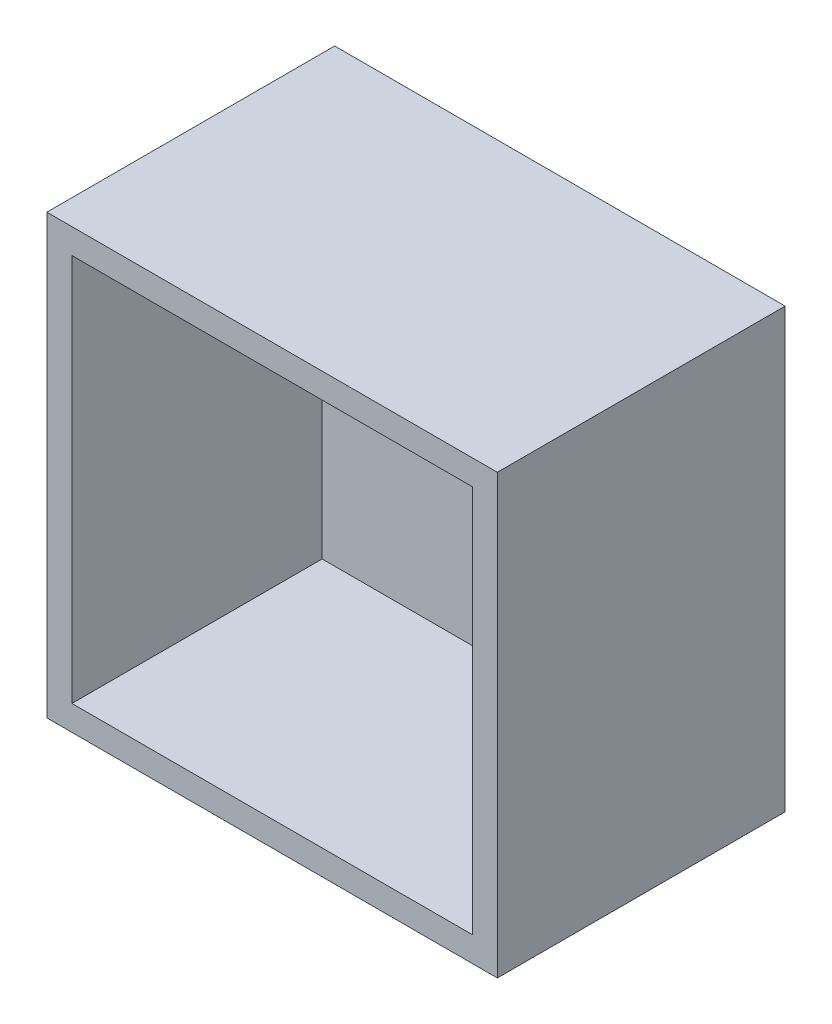
ISO-10303-21;
HEADER;
FILE_DESCRIPTION(('STEP AP214'),'2;1');
FILE_NAME('part.step','',(''),(''),'','','');
FILE_SCHEMA(('AUTOMOTIVE_DESIGN { 1 0 10303 214 1 1 1 1 }'));
ENDSEC;
DATA;
#1=APPLICATION_CONTEXT('core data for automotive mechanical design processes');
#2=APPLICATION_PROTOCOL_DEFINITION('international standard','automotive_design',2000,#1);
#3=PRODUCT_CONTEXT('',#1,'mechanical');
#4=PRODUCT('Part','Part','',(#3));
#5=PRODUCT_RELATED_PRODUCT_CATEGORY('part','',(#4));
#6=PRODUCT_DEFINITION_FORMATION('','',#4);
#7=PRODUCT_DEFINITION_CONTEXT('part definition',#1,'design');
#8=PRODUCT_DEFINITION('design','',#6,#7);
#9=PRODUCT_DEFINITION_SHAPE('','',#8);
#10=(LENGTH_UNIT() NAMED_UNIT(*) SI_UNIT(.MILLI.,.METRE.));
#11=(NAMED_UNIT(*) PLANE_ANGLE_UNIT() SI_UNIT($,.RADIAN.));
#12=(NAMED_UNIT(*) SI_UNIT($,.STERADIAN.) SOLID_ANGLE_UNIT());
#13=UNCERTAINTY_MEASURE_WITH_UNIT(LENGTH_MEASURE(1.E-05),#10,'distance_accuracy_value','');
#14=(GEOMETRIC_REPRESENTATION_CONTEXT(3) GLOBAL_UNCERTAINTY_ASSIGNED_CONTEXT((#13)) GLOBAL_UNIT_ASSIGNED_CONTEXT((#10,
#11,#12)) REPRESENTATION_CONTEXT('',''));
#15=CARTESIAN_POINT('',(0.,0.,0.));
#16=DIRECTION('',(0.,0.,1.));
#17=DIRECTION('',(1.,0.,0.));
#18=AXIS2_PLACEMENT_3D('',#15,#16,#17);
#19=CARTESIAN_POINT('',(-7.02652241815189,6.80694359258464,0.));
#20=DIRECTION('',(0.,0.,1.));
#21=DIRECTION('',(1.,0.,0.));
#22=AXIS2_PLACEMENT_3D('',#19,#20,#21);
#23=CYLINDRICAL_SURFACE('',#22,1.5);
#24=CARTESIAN_POINT('',(-7.02652241815189,6.80694359258464,0.));
#25=DIRECTION('',(0.,0.,1.));
#26=DIRECTION('',(1.,0.,0.));
#27=AXIS2_PLACEMENT_3D('',#24,#25,#26);
#28=CIRCLE('',#27,1.5);
#29=CARTESIAN_POINT('',(-5.5265224181519,6.80694359258464,0.));
#30=VERTEX_POINT('',#29);
#31=EDGE_CURVE('E166',#30,#30,#28,.T.);
#32=ORIENTED_EDGE('',*,*,#31,.F.);
#33=EDGE_LOOP('',(#32));
#34=FACE_BOUND('',#33,.T.);
#35=CARTESIAN_POINT('',(-7.02652241815189,6.80694359258464,2.));
#36=DIRECTION('',(0.,0.,1.));
#37=DIRECTION('',(1.,0.,0.));
#38=AXIS2_PLACEMENT_3D('',#35,#36,#37);
#39=CIRCLE('',#38,1.5);
#40=CARTESIAN_POINT('',(-5.5265224181519,6.80694359258464,2.));
#41=VERTEX_POINT('',#40);
#42=EDGE_CURVE('E37',#41,#41,#39,.F.);
#43=ORIENTED_EDGE('',*,*,#42,.F.);
#44=EDGE_LOOP('',(#43));
#45=FACE_BOUND('',#44,.T.);
#46=ADVANCED_FACE('F33',(#34,#45),#23,.F.);
#47=CARTESIAN_POINT('',(-24.9825279878812,24.2018239882599,0.));
#48=DIRECTION('',(0.,0.,1.));
#49=DIRECTION('',(1.,0.,0.));
#50=AXIS2_PLACEMENT_3D('',#47,#48,#49);
#51=CYLINDRICAL_SURFACE('',#50,1.5);
#52=CARTESIAN_POINT('',(-24.9825279878812,24.2018239882599,0.));
#53=DIRECTION('',(0.,0.,1.));
#54=DIRECTION('',(1.,0.,0.));
#55=AXIS2_PLACEMENT_3D('',#52,#53,#54);
#56=CIRCLE('',#55,1.5);
#57=CARTESIAN_POINT('',(-23.4825279878812,24.2018239882599,0.));
#58=VERTEX_POINT('',#57);
#59=EDGE_CURVE('E112',#58,#58,#56,.T.);
#60=ORIENTED_EDGE('',*,*,#59,.F.);
#61=EDGE_LOOP('',(#60));
#62=FACE_BOUND('',#61,.T.);
#63=CARTESIAN_POINT('',(-24.9825279878812,24.2018239882599,2.));
#64=DIRECTION('',(0.,0.,1.));
#65=DIRECTION('',(1.,0.,0.));
#66=AXIS2_PLACEMENT_3D('',#63,#64,#65);
#67=CIRCLE('',#66,1.5);
#68=CARTESIAN_POINT('',(-23.4825279878812,24.2018239882599,2.));
#69=VERTEX_POINT('',#68);
#70=EDGE_CURVE('E164',#69,#69,#67,.F.);
#71=ORIENTED_EDGE('',*,*,#70,.F.);
#72=EDGE_LOOP('',(#71));
#73=FACE_BOUND('',#72,.T.);
#74=ADVANCED_FACE('F187',(#62,#73),#51,.F.);
#75=CARTESIAN_POINT('',(0.,0.,3.));
#76=DIRECTION('',(0.,0.,1.));
#77=DIRECTION('',(1.,0.,0.));
#78=AXIS2_PLACEMENT_3D('',#75,#76,#77);
#79=PLANE('',#78);
#80=CARTESIAN_POINT('',(-7.02652241815189,6.80694359258464,3.));
#81=DIRECTION('',(0.,0.,1.));
#82=DIRECTION('',(1.,0.,0.));
#83=AXIS2_PLACEMENT_3D('',#80,#81,#82);
#84=CIRCLE('',#83,6.);
#85=CARTESIAN_POINT('',(-1.02652241815189,6.80694359258464,3.));
#86=VERTEX_POINT('',#85);
#87=EDGE_CURVE('E180',#86,#86,#84,.T.);
#88=ORIENTED_EDGE('',*,*,#87,.F.);
#89=EDGE_LOOP('',(#88));
#90=FACE_BOUND('',#89,.T.);
#91=CARTESIAN_POINT('',(-24.9825279878812,24.2018239882599,3.));
#92=DIRECTION('',(0.,0.,1.));
#93=DIRECTION('',(1.,0.,0.));
#94=AXIS2_PLACEMENT_3D('',#91,#92,#93);
#95=CIRCLE('',#94,6.);
#96=CARTESIAN_POINT('',(-18.9825279878812,24.2018239882599,3.));
#97=VERTEX_POINT('',#96);
#98=EDGE_CURVE('E173',#97,#97,#95,.T.);
#99=ORIENTED_EDGE('',*,*,#98,.F.);
#100=EDGE_LOOP('',(#99));
#101=FACE_BOUND('',#100,.T.);
#102=DIRECTION('',(0.,1.,0.));
#103=VECTOR('',#102,1.);
#104=CARTESIAN_POINT('',(0.,0.,3.));
#105=LINE('',#104,#103);
#106=CARTESIAN_POINT('',(0.,0.,3.));
#107=VERTEX_POINT('',#106);
#108=CARTESIAN_POINT('',(0.,31.,3.));
#109=VERTEX_POINT('',#108);
#110=EDGE_CURVE('E153',#107,#109,#105,.T.);
#111=ORIENTED_EDGE('',*,*,#110,.T.);
#112=DIRECTION('',(-1.,0.,0.));
#113=VECTOR('',#112,1.);
#114=CARTESIAN_POINT('',(0.,31.,3.));
#115=LINE('',#114,#113);
#116=CARTESIAN_POINT('',(-32.,31.,3.));
#117=VERTEX_POINT('',#116);
#118=EDGE_CURVE('E161',#109,#117,#115,.T.);
#119=ORIENTED_EDGE('',*,*,#118,.T.);
#120=DIRECTION('',(0.,-1.,0.));
#121=VECTOR('',#120,1.);
#122=CARTESIAN_POINT('',(-32.,0.,3.));
#123=LINE('',#122,#121);
#124=CARTESIAN_POINT('',(-32.,0.,3.));
#125=VERTEX_POINT('',#124);
#126=EDGE_CURVE('E42',#117,#125,#123,.T.);
#127=ORIENTED_EDGE('',*,*,#126,.T.);
#128=DIRECTION('',(1.,0.,0.));
#129=VECTOR('',#128,1.);
#130=CARTESIAN_POINT('',(0.,0.,3.));
#131=LINE('',#130,#129);
#132=EDGE_CURVE('E11',#125,#107,#131,.T.);
#133=ORIENTED_EDGE('',*,*,#132,.T.);
#134=EDGE_LOOP('',(#111,#119,#127,#133));
#135=FACE_BOUND('',#134,.T.);
#136=ADVANCED_FACE('F190',(#90,#101,#135),#79,.T.);
#137=CARTESIAN_POINT('',(-34.,33.,0.));
#138=DIRECTION('',(-1.,0.,0.));
#139=DIRECTION('',(0.,-1.,0.));
#140=AXIS2_PLACEMENT_3D('',#137,#138,#139);
#141=PLANE('',#140);
#142=DIRECTION('',(0.,0.,1.));
#143=VECTOR('',#142,1.);
#144=CARTESIAN_POINT('',(-34.,-2.,0.));
#145=LINE('',#144,#143);
#146=CARTESIAN_POINT('',(-34.,-2.,0.));
#147=VERTEX_POINT('',#146);
#148=CARTESIAN_POINT('',(-34.,-2.,23.));
#149=VERTEX_POINT('',#148);
#150=EDGE_CURVE('E150',#147,#149,#145,.T.);
#151=ORIENTED_EDGE('',*,*,#150,.T.);
#152=DIRECTION('',(0.,-1.,0.));
#153=VECTOR('',#152,1.);
#154=CARTESIAN_POINT('',(-34.,33.,23.));
#155=LINE('',#154,#153);
#156=CARTESIAN_POINT('',(-34.,33.,23.));
#157=VERTEX_POINT('',#156);
#158=EDGE_CURVE('E123',#157,#149,#155,.T.);
#159=ORIENTED_EDGE('',*,*,#158,.F.);
#160=DIRECTION('',(0.,0.,1.));
#161=VECTOR('',#160,1.);
#162=CARTESIAN_POINT('',(-34.,33.,0.));
#163=LINE('',#162,#161);
#164=CARTESIAN_POINT('',(-34.,33.,0.));
#165=VERTEX_POINT('',#164);
#166=EDGE_CURVE('E151',#165,#157,#163,.T.);
#167=ORIENTED_EDGE('',*,*,#166,.F.);
#168=DIRECTION('',(0.,-1.,0.));
#169=VECTOR('',#168,1.);
#170=CARTESIAN_POINT('',(-34.,33.,0.));
#171=LINE('',#170,#169);
#172=EDGE_CURVE('E135',#165,#147,#171,.T.);
#173=ORIENTED_EDGE('',*,*,#172,.T.);
#174=EDGE_LOOP('',(#151,#159,#167,#173));
#175=FACE_BOUND('',#174,.T.);
#176=ADVANCED_FACE('F196',(#175),#141,.T.);
#177=CARTESIAN_POINT('',(-34.,33.,0.));
#178=DIRECTION('',(0.,1.,0.));
#179=DIRECTION('',(0.,0.,1.));
#180=AXIS2_PLACEMENT_3D('',#177,#178,#179);
#181=PLANE('',#180);
#182=ORIENTED_EDGE('',*,*,#166,.T.);
#183=DIRECTION('',(-1.,0.,0.));
#184=VECTOR('',#183,1.);
#185=CARTESIAN_POINT('',(-34.,33.,23.));
#186=LINE('',#185,#184);
#187=CARTESIAN_POINT('',(2.,33.,23.));
#188=VERTEX_POINT('',#187);
#189=EDGE_CURVE('E103',#188,#157,#186,.T.);
#190=ORIENTED_EDGE('',*,*,#189,.F.);
#191=DIRECTION('',(0.,0.,1.));
#192=VECTOR('',#191,1.);
#193=CARTESIAN_POINT('',(2.,33.,0.));
#194=LINE('',#193,#192);
#195=CARTESIAN_POINT('',(2.,33.,0.));
#196=VERTEX_POINT('',#195);
#197=EDGE_CURVE('E154',#196,#188,#194,.T.);
#198=ORIENTED_EDGE('',*,*,#197,.F.);
#199=DIRECTION('',(-1.,0.,0.));
#200=VECTOR('',#199,1.);
#201=CARTESIAN_POINT('',(-34.,33.,0.));
#202=LINE('',#201,#200);
#203=EDGE_CURVE('E147',#196,#165,#202,.T.);
#204=ORIENTED_EDGE('',*,*,#203,.T.);
#205=EDGE_LOOP('',(#182,#190,#198,#204));
#206=FACE_BOUND('',#205,.T.);
#207=ADVANCED_FACE('F218',(#206),#181,.T.);
#208=CARTESIAN_POINT('',(2.,33.,0.));
#209=DIRECTION('',(1.,0.,0.));
#210=DIRECTION('',(0.,1.,0.));
#211=AXIS2_PLACEMENT_3D('',#208,#209,#210);
#212=PLANE('',#211);
#213=ORIENTED_EDGE('',*,*,#197,.T.);
#214=DIRECTION('',(0.,1.,0.));
#215=VECTOR('',#214,1.);
#216=CARTESIAN_POINT('',(2.,33.,23.));
#217=LINE('',#216,#215);
#218=CARTESIAN_POINT('',(2.00000000000001,-2.,23.));
#219=VERTEX_POINT('',#218);
#220=EDGE_CURVE('E129',#219,#188,#217,.T.);
#221=ORIENTED_EDGE('',*,*,#220,.F.);
#222=DIRECTION('',(0.,0.,1.));
#223=VECTOR('',#222,1.);
#224=CARTESIAN_POINT('',(2.00000000000001,-2.,0.));
#225=LINE('',#224,#223);
#226=CARTESIAN_POINT('',(2.00000000000001,-2.,0.));
#227=VERTEX_POINT('',#226);
#228=EDGE_CURVE('E156',#227,#219,#225,.T.);
#229=ORIENTED_EDGE('',*,*,#228,.F.);
#230=DIRECTION('',(0.,1.,0.));
#231=VECTOR('',#230,1.);
#232=CARTESIAN_POINT('',(2.,33.,0.));
#233=LINE('',#232,#231);
#234=EDGE_CURVE('E144',#227,#196,#233,.T.);
#235=ORIENTED_EDGE('',*,*,#234,.T.);
#236=EDGE_LOOP('',(#213,#221,#229,#235));
#237=FACE_BOUND('',#236,.T.);
#238=ADVANCED_FACE('F221',(#237),#212,.T.);
#239=CARTESIAN_POINT('',(-34.,-2.,0.));
#240=DIRECTION('',(0.,-1.,0.));
#241=DIRECTION('',(0.,0.,-1.));
#242=AXIS2_PLACEMENT_3D('',#239,#240,#241);
#243=PLANE('',#242);
#244=ORIENTED_EDGE('',*,*,#228,.T.);
#245=DIRECTION('',(1.,0.,0.));
#246=VECTOR('',#245,1.);
#247=CARTESIAN_POINT('',(-34.,-2.,23.));
#248=LINE('',#247,#246);
#249=EDGE_CURVE('E126',#149,#219,#248,.T.);
#250=ORIENTED_EDGE('',*,*,#249,.F.);
#251=ORIENTED_EDGE('',*,*,#150,.F.);
#252=DIRECTION('',(1.,0.,0.));
#253=VECTOR('',#252,1.);
#254=CARTESIAN_POINT('',(-34.,-2.,0.));
#255=LINE('',#254,#253);
#256=EDGE_CURVE('E141',#147,#227,#255,.T.);
#257=ORIENTED_EDGE('',*,*,#256,.T.);
#258=EDGE_LOOP('',(#244,#250,#251,#257));
#259=FACE_BOUND('',#258,.T.);
#260=ADVANCED_FACE('F217',(#259),#243,.T.);
#261=CARTESIAN_POINT('',(-32.,31.,0.));
#262=DIRECTION('',(-1.,0.,0.));
#263=DIRECTION('',(0.,0.,1.));
#264=AXIS2_PLACEMENT_3D('',#261,#262,#263);
#265=PLANE('',#264);
#266=ORIENTED_EDGE('',*,*,#126,.F.);
#267=DIRECTION('',(0.,0.,1.));
#268=VECTOR('',#267,1.);
#269=CARTESIAN_POINT('',(-32.,31.,0.));
#270=LINE('',#269,#268);
#271=CARTESIAN_POINT('',(-32.,31.,23.));
#272=VERTEX_POINT('',#271);
#273=EDGE_CURVE('E108',#117,#272,#270,.T.);
#274=ORIENTED_EDGE('',*,*,#273,.T.);
#275=DIRECTION('',(0.,-1.,0.));
#276=VECTOR('',#275,1.);
#277=CARTESIAN_POINT('',(-32.,31.,23.));
#278=LINE('',#277,#276);
#279=CARTESIAN_POINT('',(-32.,0.,23.));
#280=VERTEX_POINT('',#279);
#281=EDGE_CURVE('E106',#272,#280,#278,.T.);
#282=ORIENTED_EDGE('',*,*,#281,.T.);
#283=DIRECTION('',(0.,0.,1.));
#284=VECTOR('',#283,1.);
#285=CARTESIAN_POINT('',(-32.,0.,0.));
#286=LINE('',#285,#284);
#287=EDGE_CURVE('E97',#125,#280,#286,.T.);
#288=ORIENTED_EDGE('',*,*,#287,.F.);
#289=EDGE_LOOP('',(#266,#274,#282,#288));
#290=FACE_BOUND('',#289,.T.);
#291=ADVANCED_FACE('F107',(#290),#265,.F.);
#292=CARTESIAN_POINT('',(-32.,31.,0.));
#293=DIRECTION('',(0.,1.,0.));
#294=DIRECTION('',(0.,0.,1.));
#295=AXIS2_PLACEMENT_3D('',#292,#293,#294);
#296=PLANE('',#295);
#297=ORIENTED_EDGE('',*,*,#118,.F.);
#298=DIRECTION('',(0.,0.,1.));
#299=VECTOR('',#298,1.);
#300=CARTESIAN_POINT('',(0.,31.,0.));
#301=LINE('',#300,#299);
#302=CARTESIAN_POINT('',(0.,31.,23.));
#303=VERTEX_POINT('',#302);
#304=EDGE_CURVE('E136',#109,#303,#301,.T.);
#305=ORIENTED_EDGE('',*,*,#304,.T.);
#306=DIRECTION('',(-1.,0.,0.));
#307=VECTOR('',#306,1.);
#308=CARTESIAN_POINT('',(-32.,31.,23.));
#309=LINE('',#308,#307);
#310=EDGE_CURVE('E118',#303,#272,#309,.T.);
#311=ORIENTED_EDGE('',*,*,#310,.T.);
#312=ORIENTED_EDGE('',*,*,#273,.F.);
#313=EDGE_LOOP('',(#297,#305,#311,#312));
#314=FACE_BOUND('',#313,.T.);
#315=ADVANCED_FACE('F205',(#314),#296,.F.);
#316=CARTESIAN_POINT('',(0.,31.,0.));
#317=DIRECTION('',(1.,0.,0.));
#318=DIRECTION('',(0.,0.,-1.));
#319=AXIS2_PLACEMENT_3D('',#316,#317,#318);
#320=PLANE('',#319);
#321=ORIENTED_EDGE('',*,*,#110,.F.);
#322=DIRECTION('',(0.,0.,1.));
#323=VECTOR('',#322,1.);
#324=CARTESIAN_POINT('',(0.,0.,0.));
#325=LINE('',#324,#323);
#326=CARTESIAN_POINT('',(0.,0.,23.));
#327=VERTEX_POINT('',#326);
#328=EDGE_CURVE('E50',#107,#327,#325,.T.);
#329=ORIENTED_EDGE('',*,*,#328,.T.);
#330=DIRECTION('',(0.,1.,0.));
#331=VECTOR('',#330,1.);
#332=CARTESIAN_POINT('',(0.,31.,23.));
#333=LINE('',#332,#331);
#334=EDGE_CURVE('E116',#327,#303,#333,.T.);
#335=ORIENTED_EDGE('',*,*,#334,.T.);
#336=ORIENTED_EDGE('',*,*,#304,.F.);
#337=EDGE_LOOP('',(#321,#329,#335,#336));
#338=FACE_BOUND('',#337,.T.);
#339=ADVANCED_FACE('F208',(#338),#320,.F.);
#340=CARTESIAN_POINT('',(-32.,0.,0.));
#341=DIRECTION('',(0.,-1.,0.));
#342=DIRECTION('',(0.,0.,-1.));
#343=AXIS2_PLACEMENT_3D('',#340,#341,#342);
#344=PLANE('',#343);
#345=ORIENTED_EDGE('',*,*,#132,.F.);
#346=ORIENTED_EDGE('',*,*,#287,.T.);
#347=DIRECTION('',(1.,0.,0.));
#348=VECTOR('',#347,1.);
#349=CARTESIAN_POINT('',(-32.,0.,23.));
#350=LINE('',#349,#348);
#351=EDGE_CURVE('E101',#280,#327,#350,.T.);
#352=ORIENTED_EDGE('',*,*,#351,.T.);
#353=ORIENTED_EDGE('',*,*,#328,.F.);
#354=EDGE_LOOP('',(#345,#346,#352,#353));
#355=FACE_BOUND('',#354,.T.);
#356=ADVANCED_FACE('F99',(#355),#344,.F.);
#357=CARTESIAN_POINT('',(0.,0.,23.));
#358=DIRECTION('',(0.,0.,1.));
#359=DIRECTION('',(1.,0.,0.));
#360=AXIS2_PLACEMENT_3D('',#357,#358,#359);
#361=PLANE('',#360);
#362=ORIENTED_EDGE('',*,*,#158,.T.);
#363=ORIENTED_EDGE('',*,*,#249,.T.);
#364=ORIENTED_EDGE('',*,*,#220,.T.);
#365=ORIENTED_EDGE('',*,*,#189,.T.);
#366=EDGE_LOOP('',(#362,#363,#364,#365));
#367=FACE_BOUND('',#366,.T.);
#368=ORIENTED_EDGE('',*,*,#351,.F.);
#369=ORIENTED_EDGE('',*,*,#281,.F.);
#370=ORIENTED_EDGE('',*,*,#310,.F.);
#371=ORIENTED_EDGE('',*,*,#334,.F.);
#372=EDGE_LOOP('',(#368,#369,#370,#371));
#373=FACE_BOUND('',#372,.T.);
#374=ADVANCED_FACE('F114',(#367,#373),#361,.T.);
#375=CARTESIAN_POINT('',(0.,0.,0.));
#376=DIRECTION('',(0.,0.,1.));
#377=DIRECTION('',(1.,0.,0.));
#378=AXIS2_PLACEMENT_3D('',#375,#376,#377);
#379=PLANE('',#378);
#380=ORIENTED_EDGE('',*,*,#31,.T.);
#381=EDGE_LOOP('',(#380));
#382=FACE_BOUND('',#381,.T.);
#383=ORIENTED_EDGE('',*,*,#59,.T.);
#384=EDGE_LOOP('',(#383));
#385=FACE_BOUND('',#384,.T.);
#386=ORIENTED_EDGE('',*,*,#172,.F.);
#387=ORIENTED_EDGE('',*,*,#203,.F.);
#388=ORIENTED_EDGE('',*,*,#234,.F.);
#389=ORIENTED_EDGE('',*,*,#256,.F.);
#390=EDGE_LOOP('',(#386,#387,#388,#389));
#391=FACE_BOUND('',#390,.T.);
#392=ADVANCED_FACE('F35',(#382,#385,#391),#379,.F.);
#393=CARTESIAN_POINT('',(-24.9825279878812,24.2018239882599,2.));
#394=DIRECTION('',(0.,0.,1.));
#395=DIRECTION('',(1.,0.,0.));
#396=AXIS2_PLACEMENT_3D('',#393,#394,#395);
#397=PLANE('',#396);
#398=CARTESIAN_POINT('',(-24.9825279878812,24.2018239882599,2.));
#399=DIRECTION('',(0.,0.,1.));
#400=DIRECTION('',(1.,0.,0.));
#401=AXIS2_PLACEMENT_3D('',#398,#399,#400);
#402=CIRCLE('',#401,6.);
#403=CARTESIAN_POINT('',(-18.9825279878812,24.2018239882599,2.));
#404=VERTEX_POINT('',#403);
#405=EDGE_CURVE('E167',#404,#404,#402,.T.);
#406=ORIENTED_EDGE('',*,*,#405,.T.);
#407=EDGE_LOOP('',(#406));
#408=FACE_BOUND('',#407,.T.);
#409=ORIENTED_EDGE('',*,*,#70,.T.);
#410=EDGE_LOOP('',(#409));
#411=FACE_BOUND('',#410,.T.);
#412=ADVANCED_FACE('F242',(#408,#411),#397,.T.);
#413=CARTESIAN_POINT('',(-24.9825279878812,24.2018239882599,2.));
#414=DIRECTION('',(0.,0.,1.));
#415=DIRECTION('',(1.,0.,0.));
#416=AXIS2_PLACEMENT_3D('',#413,#414,#415);
#417=CYLINDRICAL_SURFACE('',#416,6.);
#418=ORIENTED_EDGE('',*,*,#405,.F.);
#419=EDGE_LOOP('',(#418));
#420=FACE_BOUND('',#419,.T.);
#421=ORIENTED_EDGE('',*,*,#98,.T.);
#422=EDGE_LOOP('',(#421));
#423=FACE_BOUND('',#422,.T.);
#424=ADVANCED_FACE('F247',(#420,#423),#417,.F.);
#425=CARTESIAN_POINT('',(-7.02652241815189,6.80694359258464,2.));
#426=DIRECTION('',(0.,0.,1.));
#427=DIRECTION('',(1.,0.,0.));
#428=AXIS2_PLACEMENT_3D('',#425,#426,#427);
#429=PLANE('',#428);
#430=CARTESIAN_POINT('',(-7.02652241815189,6.80694359258464,2.));
#431=DIRECTION('',(0.,0.,1.));
#432=DIRECTION('',(1.,0.,0.));
#433=AXIS2_PLACEMENT_3D('',#430,#431,#432);
#434=CIRCLE('',#433,6.);
#435=CARTESIAN_POINT('',(-1.02652241815189,6.80694359258464,2.));
#436=VERTEX_POINT('',#435);
#437=EDGE_CURVE('E254',#436,#436,#434,.T.);
#438=ORIENTED_EDGE('',*,*,#437,.T.);
#439=EDGE_LOOP('',(#438));
#440=FACE_BOUND('',#439,.T.);
#441=ORIENTED_EDGE('',*,*,#42,.T.);
#442=EDGE_LOOP('',(#441));
#443=FACE_BOUND('',#442,.T.);
#444=ADVANCED_FACE('F268',(#440,#443),#429,.T.);
#445=CARTESIAN_POINT('',(-7.02652241815189,6.80694359258464,2.));
#446=DIRECTION('',(0.,0.,1.));
#447=DIRECTION('',(1.,0.,0.));
#448=AXIS2_PLACEMENT_3D('',#445,#446,#447);
#449=CYLINDRICAL_SURFACE('',#448,6.);
#450=ORIENTED_EDGE('',*,*,#437,.F.);
#451=EDGE_LOOP('',(#450));
#452=FACE_BOUND('',#451,.T.);
#453=ORIENTED_EDGE('',*,*,#87,.T.);
#454=EDGE_LOOP('',(#453));
#455=FACE_BOUND('',#454,.T.);
#456=ADVANCED_FACE('F261',(#452,#455),#449,.F.);
#457=CLOSED_SHELL('',(#46,#74,#136,#176,#207,#238,#260,#291,#315,#339,#356,#374,#392,#412,#424,
#444,#456));
#458=MANIFOLD_SOLID_BREP('B2',#457);
#459=ADVANCED_BREP_SHAPE_REPRESENTATION('',(#18,#458),#14);
#460=SHAPE_DEFINITION_REPRESENTATION(#9,#459);
ENDSEC;
END-ISO-10303-21;
